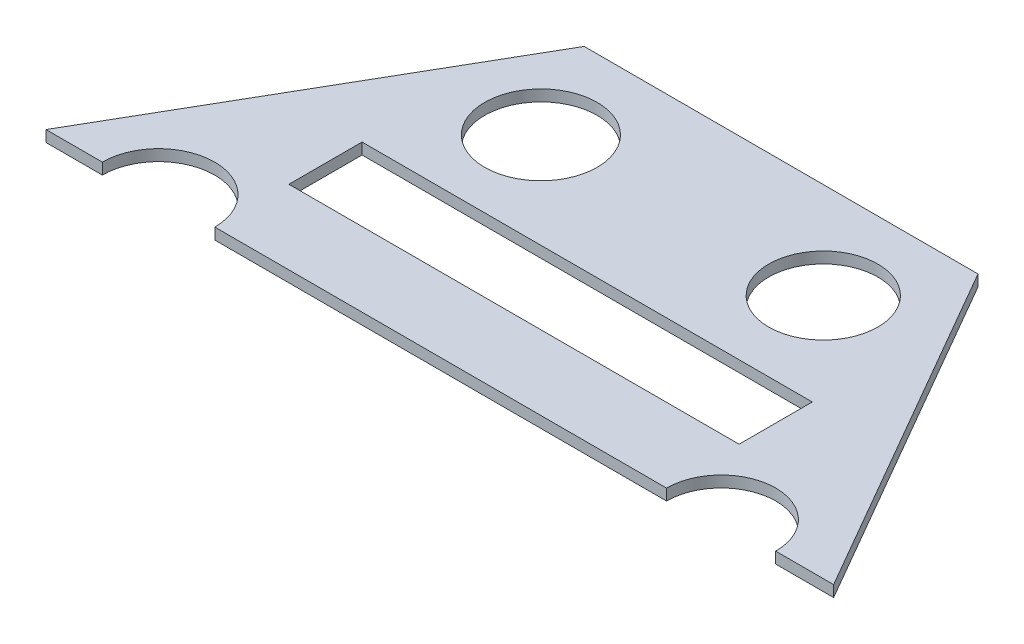
ISO-10303-21;
HEADER;
FILE_DESCRIPTION(('STEP AP214'),'2;1');
FILE_NAME('part.step','',(''),(''),'','','');
FILE_SCHEMA(('AUTOMOTIVE_DESIGN { 1 0 10303 214 1 1 1 1 }'));
ENDSEC;
DATA;
#1=APPLICATION_CONTEXT('core data for automotive mechanical design processes');
#2=APPLICATION_PROTOCOL_DEFINITION('international standard','automotive_design',2000,#1);
#3=PRODUCT_CONTEXT('',#1,'mechanical');
#4=PRODUCT('Part','Part','',(#3));
#5=PRODUCT_RELATED_PRODUCT_CATEGORY('part','',(#4));
#6=PRODUCT_DEFINITION_FORMATION('','',#4);
#7=PRODUCT_DEFINITION_CONTEXT('part definition',#1,'design');
#8=PRODUCT_DEFINITION('design','',#6,#7);
#9=PRODUCT_DEFINITION_SHAPE('','',#8);
#10=(LENGTH_UNIT() NAMED_UNIT(*) SI_UNIT(.MILLI.,.METRE.));
#11=(NAMED_UNIT(*) PLANE_ANGLE_UNIT() SI_UNIT($,.RADIAN.));
#12=(NAMED_UNIT(*) SI_UNIT($,.STERADIAN.) SOLID_ANGLE_UNIT());
#13=UNCERTAINTY_MEASURE_WITH_UNIT(LENGTH_MEASURE(1.E-05),#10,'distance_accuracy_value','');
#14=(GEOMETRIC_REPRESENTATION_CONTEXT(3) GLOBAL_UNCERTAINTY_ASSIGNED_CONTEXT((#13)) GLOBAL_UNIT_ASSIGNED_CONTEXT((#10,
#11,#12)) REPRESENTATION_CONTEXT('',''));
#15=CARTESIAN_POINT('',(0.,0.,0.));
#16=DIRECTION('',(0.,0.,1.));
#17=DIRECTION('',(1.,0.,0.));
#18=AXIS2_PLACEMENT_3D('',#15,#16,#17);
#19=CARTESIAN_POINT('',(0.,10.,0.));
#20=DIRECTION('',(0.,1.,0.));
#21=DIRECTION('',(0.,0.,1.));
#22=AXIS2_PLACEMENT_3D('',#19,#20,#21);
#23=PLANE('',#22);
#24=CARTESIAN_POINT('',(122.996764387359,10.,-217.69749897333));
#25=DIRECTION('',(0.,1.,0.));
#26=DIRECTION('',(0.,0.,1.));
#27=AXIS2_PLACEMENT_3D('',#24,#25,#26);
#28=CIRCLE('',#27,48.5);
#29=CARTESIAN_POINT('',(122.996764387359,10.,-169.19749897333));
#30=VERTEX_POINT('',#29);
#31=EDGE_CURVE('E201',#30,#30,#28,.T.);
#32=ORIENTED_EDGE('',*,*,#31,.F.);
#33=EDGE_LOOP('',(#32));
#34=FACE_BOUND('',#33,.T.);
#35=CARTESIAN_POINT('',(-126.076603065598,10.,-215.895357645728));
#36=DIRECTION('',(0.,1.,0.));
#37=DIRECTION('',(0.,0.,1.));
#38=AXIS2_PLACEMENT_3D('',#35,#36,#37);
#39=CIRCLE('',#38,50.);
#40=CARTESIAN_POINT('',(-126.076603065598,10.,-165.895357645728));
#41=VERTEX_POINT('',#40);
#42=EDGE_CURVE('E192',#41,#41,#39,.T.);
#43=ORIENTED_EDGE('',*,*,#42,.F.);
#44=EDGE_LOOP('',(#43));
#45=FACE_BOUND('',#44,.T.);
#46=DIRECTION('',(0.,0.,-1.));
#47=VECTOR('',#46,1.);
#48=CARTESIAN_POINT('',(200.,10.,-65.913699872319));
#49=LINE('',#48,#47);
#50=CARTESIAN_POINT('',(200.,10.,-65.913699872319));
#51=VERTEX_POINT('',#50);
#52=CARTESIAN_POINT('',(200.,10.,-130.913699872319));
#53=VERTEX_POINT('',#52);
#54=EDGE_CURVE('E221',#51,#53,#49,.T.);
#55=ORIENTED_EDGE('',*,*,#54,.F.);
#56=DIRECTION('',(1.,0.,0.));
#57=VECTOR('',#56,1.);
#58=CARTESIAN_POINT('',(-200.,10.,-65.913699872319));
#59=LINE('',#58,#57);
#60=CARTESIAN_POINT('',(-200.,10.,-65.913699872319));
#61=VERTEX_POINT('',#60);
#62=EDGE_CURVE('E211',#61,#51,#59,.T.);
#63=ORIENTED_EDGE('',*,*,#62,.F.);
#64=DIRECTION('',(0.,0.,1.));
#65=VECTOR('',#64,1.);
#66=CARTESIAN_POINT('',(-200.,10.,-65.913699872319));
#67=LINE('',#66,#65);
#68=CARTESIAN_POINT('',(-200.,10.,-130.913699872319));
#69=VERTEX_POINT('',#68);
#70=EDGE_CURVE('E226',#69,#61,#67,.T.);
#71=ORIENTED_EDGE('',*,*,#70,.F.);
#72=DIRECTION('',(-1.,0.,0.));
#73=VECTOR('',#72,1.);
#74=CARTESIAN_POINT('',(-200.,10.,-130.913699872319));
#75=LINE('',#74,#73);
#76=EDGE_CURVE('E223',#53,#69,#75,.T.);
#77=ORIENTED_EDGE('',*,*,#76,.F.);
#78=EDGE_LOOP('',(#55,#63,#71,#77));
#79=FACE_BOUND('',#78,.T.);
#80=DIRECTION('',(-0.500290723945736,0.,0.865857489159649));
#81=VECTOR('',#80,1.);
#82=CARTESIAN_POINT('',(-174.898226893739,10.,-303.167627278089));
#83=LINE('',#82,#81);
#84=CARTESIAN_POINT('',(-174.898226893739,10.,-303.167627278089));
#85=VERTEX_POINT('',#84);
#86=CARTESIAN_POINT('',(-349.999980274746,10.,-0.117506072211837));
#87=VERTEX_POINT('',#86);
#88=EDGE_CURVE('E148',#85,#87,#83,.T.);
#89=ORIENTED_EDGE('',*,*,#88,.T.);
#90=DIRECTION('',(0.999999943642133,0.,0.000335731634890988));
#91=VECTOR('',#90,1.);
#92=CARTESIAN_POINT('',(0.,10.,0.));
#93=LINE('',#92,#91);
#94=CARTESIAN_POINT('',(-299.999973945815,10.,-0.100719487396418));
#95=VERTEX_POINT('',#94);
#96=EDGE_CURVE('E137',#87,#95,#93,.T.);
#97=ORIENTED_EDGE('',*,*,#96,.T.);
#98=CARTESIAN_POINT('',(-250.000009416956,10.,-0.041161844969737));
#99=DIRECTION('',(0.,1.,0.));
#100=DIRECTION('',(0.,0.,1.));
#101=AXIS2_PLACEMENT_3D('',#98,#99,#100);
#102=CIRCLE('',#101,50.);
#103=CARTESIAN_POINT('',(-200.000016168894,10.,-0.067146336190831));
#104=VERTEX_POINT('',#103);
#105=EDGE_CURVE('E182',#104,#95,#102,.T.);
#106=ORIENTED_EDGE('',*,*,#105,.F.);
#107=CARTESIAN_POINT('',(201.500027455327,10.,0.0676499374607618));
#108=VERTEX_POINT('',#107);
#109=EDGE_CURVE('E63',#104,#108,#93,.T.);
#110=ORIENTED_EDGE('',*,*,#109,.T.);
#111=CARTESIAN_POINT('',(249.999980274746,10.,1.63931368479808E-13));
#112=DIRECTION('',(0.,1.,0.));
#113=DIRECTION('',(0.,0.,1.));
#114=AXIS2_PLACEMENT_3D('',#111,#112,#113);
#115=CIRCLE('',#114,48.5);
#116=CARTESIAN_POINT('',(298.499876736306,10.,0.10021585727939));
#117=VERTEX_POINT('',#116);
#118=EDGE_CURVE('E190',#117,#108,#115,.T.);
#119=ORIENTED_EDGE('',*,*,#118,.F.);
#120=CARTESIAN_POINT('',(349.999980274746,10.,0.117506072211865));
#121=VERTEX_POINT('',#120);
#122=EDGE_CURVE('E56',#117,#121,#93,.T.);
#123=ORIENTED_EDGE('',*,*,#122,.T.);
#124=DIRECTION('',(-0.499709219696397,0.,-0.86619322079454));
#125=VECTOR('',#124,1.);
#126=CARTESIAN_POINT('',(349.999980274746,10.,0.117506072211846));
#127=LINE('',#126,#125);
#128=CARTESIAN_POINT('',(175.101753381008,10.,-303.050121205877));
#129=VERTEX_POINT('',#128);
#130=EDGE_CURVE('E146',#121,#129,#127,.T.);
#131=ORIENTED_EDGE('',*,*,#130,.T.);
#132=DIRECTION('',(-0.999999943642133,0.,-0.00033573163489128));
#133=VECTOR('',#132,1.);
#134=CARTESIAN_POINT('',(175.101753381008,10.,-303.050121205877));
#135=LINE('',#134,#133);
#136=EDGE_CURVE('E236',#129,#85,#135,.T.);
#137=ORIENTED_EDGE('',*,*,#136,.T.);
#138=EDGE_LOOP('',(#89,#97,#106,#110,#119,#123,#131,#137));
#139=FACE_BOUND('',#138,.T.);
#140=ADVANCED_FACE('F41',(#34,#45,#79,#139),#23,.T.);
#141=CARTESIAN_POINT('',(0.,0.,0.));
#142=DIRECTION('',(0.,1.,0.));
#143=DIRECTION('',(0.,0.,1.));
#144=AXIS2_PLACEMENT_3D('',#141,#142,#143);
#145=PLANE('',#144);
#146=DIRECTION('',(1.,0.,0.));
#147=VECTOR('',#146,1.);
#148=CARTESIAN_POINT('',(-200.,0.,-65.913699872319));
#149=LINE('',#148,#147);
#150=CARTESIAN_POINT('',(-200.,0.,-65.913699872319));
#151=VERTEX_POINT('',#150);
#152=CARTESIAN_POINT('',(200.,0.,-65.913699872319));
#153=VERTEX_POINT('',#152);
#154=EDGE_CURVE('E217',#151,#153,#149,.T.);
#155=ORIENTED_EDGE('',*,*,#154,.T.);
#156=DIRECTION('',(0.,0.,-1.));
#157=VECTOR('',#156,1.);
#158=CARTESIAN_POINT('',(200.,0.,-65.913699872319));
#159=LINE('',#158,#157);
#160=CARTESIAN_POINT('',(200.,0.,-130.913699872319));
#161=VERTEX_POINT('',#160);
#162=EDGE_CURVE('E207',#153,#161,#159,.T.);
#163=ORIENTED_EDGE('',*,*,#162,.T.);
#164=DIRECTION('',(-1.,0.,0.));
#165=VECTOR('',#164,1.);
#166=CARTESIAN_POINT('',(-200.,0.,-130.913699872319));
#167=LINE('',#166,#165);
#168=CARTESIAN_POINT('',(-200.,0.,-130.913699872319));
#169=VERTEX_POINT('',#168);
#170=EDGE_CURVE('E210',#161,#169,#167,.T.);
#171=ORIENTED_EDGE('',*,*,#170,.T.);
#172=DIRECTION('',(0.,0.,1.));
#173=VECTOR('',#172,1.);
#174=CARTESIAN_POINT('',(-200.,0.,-65.913699872319));
#175=LINE('',#174,#173);
#176=EDGE_CURVE('E214',#169,#151,#175,.T.);
#177=ORIENTED_EDGE('',*,*,#176,.T.);
#178=EDGE_LOOP('',(#155,#163,#171,#177));
#179=FACE_BOUND('',#178,.T.);
#180=CARTESIAN_POINT('',(-126.076603065598,0.,-215.895357645728));
#181=DIRECTION('',(0.,1.,0.));
#182=DIRECTION('',(0.,0.,1.));
#183=AXIS2_PLACEMENT_3D('',#180,#181,#182);
#184=CIRCLE('',#183,50.);
#185=CARTESIAN_POINT('',(-126.076603065598,0.,-165.895357645728));
#186=VERTEX_POINT('',#185);
#187=EDGE_CURVE('E198',#186,#186,#184,.T.);
#188=ORIENTED_EDGE('',*,*,#187,.T.);
#189=EDGE_LOOP('',(#188));
#190=FACE_BOUND('',#189,.T.);
#191=CARTESIAN_POINT('',(122.996764387359,0.,-217.69749897333));
#192=DIRECTION('',(0.,1.,0.));
#193=DIRECTION('',(0.,0.,1.));
#194=AXIS2_PLACEMENT_3D('',#191,#192,#193);
#195=CIRCLE('',#194,48.5);
#196=CARTESIAN_POINT('',(122.996764387359,0.,-169.19749897333));
#197=VERTEX_POINT('',#196);
#198=EDGE_CURVE('E204',#197,#197,#195,.T.);
#199=ORIENTED_EDGE('',*,*,#198,.T.);
#200=EDGE_LOOP('',(#199));
#201=FACE_BOUND('',#200,.T.);
#202=DIRECTION('',(0.999999943642133,0.,0.000335731634890988));
#203=VECTOR('',#202,1.);
#204=CARTESIAN_POINT('',(0.,0.,0.));
#205=LINE('',#204,#203);
#206=CARTESIAN_POINT('',(-349.999980274746,0.,-0.117506072211837));
#207=VERTEX_POINT('',#206);
#208=CARTESIAN_POINT('',(-299.999973945815,0.,-0.100719487396418));
#209=VERTEX_POINT('',#208);
#210=EDGE_CURVE('E139',#207,#209,#205,.T.);
#211=ORIENTED_EDGE('',*,*,#210,.F.);
#212=DIRECTION('',(-0.500290723945736,0.,0.865857489159649));
#213=VECTOR('',#212,1.);
#214=CARTESIAN_POINT('',(-174.898226893739,0.,-303.167627278089));
#215=LINE('',#214,#213);
#216=CARTESIAN_POINT('',(-174.898226893739,0.,-303.167627278089));
#217=VERTEX_POINT('',#216);
#218=EDGE_CURVE('E157',#217,#207,#215,.T.);
#219=ORIENTED_EDGE('',*,*,#218,.F.);
#220=DIRECTION('',(-0.999999943642133,0.,-0.00033573163489128));
#221=VECTOR('',#220,1.);
#222=CARTESIAN_POINT('',(175.101753381008,0.,-303.050121205877));
#223=LINE('',#222,#221);
#224=CARTESIAN_POINT('',(175.101753381008,0.,-303.050121205877));
#225=VERTEX_POINT('',#224);
#226=EDGE_CURVE('E153',#225,#217,#223,.T.);
#227=ORIENTED_EDGE('',*,*,#226,.F.);
#228=DIRECTION('',(-0.499709219696397,0.,-0.86619322079454));
#229=VECTOR('',#228,1.);
#230=CARTESIAN_POINT('',(349.999980274746,0.,0.117506072211846));
#231=LINE('',#230,#229);
#232=CARTESIAN_POINT('',(349.999980274746,0.,0.117506072211865));
#233=VERTEX_POINT('',#232);
#234=EDGE_CURVE('E144',#233,#225,#231,.T.);
#235=ORIENTED_EDGE('',*,*,#234,.F.);
#236=CARTESIAN_POINT('',(298.499876736306,0.,0.10021585727939));
#237=VERTEX_POINT('',#236);
#238=EDGE_CURVE('E127',#237,#233,#205,.T.);
#239=ORIENTED_EDGE('',*,*,#238,.F.);
#240=CARTESIAN_POINT('',(249.999980274746,0.,1.63931368479808E-13));
#241=DIRECTION('',(0.,1.,0.));
#242=DIRECTION('',(0.,0.,1.));
#243=AXIS2_PLACEMENT_3D('',#240,#241,#242);
#244=CIRCLE('',#243,48.5);
#245=CARTESIAN_POINT('',(201.500027455327,0.,0.0676499374607618));
#246=VERTEX_POINT('',#245);
#247=EDGE_CURVE('E187',#237,#246,#244,.T.);
#248=ORIENTED_EDGE('',*,*,#247,.T.);
#249=CARTESIAN_POINT('',(-200.000016168894,0.,-0.067146336190831));
#250=VERTEX_POINT('',#249);
#251=EDGE_CURVE('E136',#250,#246,#205,.T.);
#252=ORIENTED_EDGE('',*,*,#251,.F.);
#253=CARTESIAN_POINT('',(-250.000009416956,0.,-0.041161844969737));
#254=DIRECTION('',(0.,1.,0.));
#255=DIRECTION('',(0.,0.,1.));
#256=AXIS2_PLACEMENT_3D('',#253,#254,#255);
#257=CIRCLE('',#256,50.);
#258=EDGE_CURVE('E188',#250,#209,#257,.T.);
#259=ORIENTED_EDGE('',*,*,#258,.T.);
#260=EDGE_LOOP('',(#211,#219,#227,#235,#239,#248,#252,#259));
#261=FACE_BOUND('',#260,.T.);
#262=ADVANCED_FACE('F151',(#179,#190,#201,#261),#145,.F.);
#263=CARTESIAN_POINT('',(249.999980274746,0.,1.63931368479808E-13));
#264=DIRECTION('',(0.,1.,0.));
#265=DIRECTION('',(0.,0.,1.));
#266=AXIS2_PLACEMENT_3D('',#263,#264,#265);
#267=CYLINDRICAL_SURFACE('',#266,48.5);
#268=DIRECTION('',(0.,1.,0.));
#269=VECTOR('',#268,1.);
#270=CARTESIAN_POINT('',(298.499876736306,0.,0.10021585727939));
#271=LINE('',#270,#269);
#272=EDGE_CURVE('E131',#117,#237,#271,.F.);
#273=ORIENTED_EDGE('',*,*,#272,.F.);
#274=ORIENTED_EDGE('',*,*,#118,.T.);
#275=DIRECTION('',(0.,1.,0.));
#276=VECTOR('',#275,1.);
#277=CARTESIAN_POINT('',(201.500027455327,0.,0.0676499374607618));
#278=LINE('',#277,#276);
#279=EDGE_CURVE('E243',#246,#108,#278,.T.);
#280=ORIENTED_EDGE('',*,*,#279,.F.);
#281=ORIENTED_EDGE('',*,*,#247,.F.);
#282=EDGE_LOOP('',(#273,#274,#280,#281));
#283=FACE_BOUND('',#282,.T.);
#284=ADVANCED_FACE('F250',(#283),#267,.F.);
#285=CARTESIAN_POINT('',(-250.000009416956,0.,-0.041161844969737));
#286=DIRECTION('',(0.,1.,0.));
#287=DIRECTION('',(0.,0.,1.));
#288=AXIS2_PLACEMENT_3D('',#285,#286,#287);
#289=CYLINDRICAL_SURFACE('',#288,50.);
#290=DIRECTION('',(0.,1.,0.));
#291=VECTOR('',#290,1.);
#292=CARTESIAN_POINT('',(-200.000016168894,0.,-0.067146336190831));
#293=LINE('',#292,#291);
#294=EDGE_CURVE('E11',#104,#250,#293,.F.);
#295=ORIENTED_EDGE('',*,*,#294,.F.);
#296=ORIENTED_EDGE('',*,*,#105,.T.);
#297=DIRECTION('',(0.,1.,0.));
#298=VECTOR('',#297,1.);
#299=CARTESIAN_POINT('',(-299.999973945815,0.,-0.100719487396418));
#300=LINE('',#299,#298);
#301=EDGE_CURVE('E49',#209,#95,#300,.T.);
#302=ORIENTED_EDGE('',*,*,#301,.F.);
#303=ORIENTED_EDGE('',*,*,#258,.F.);
#304=EDGE_LOOP('',(#295,#296,#302,#303));
#305=FACE_BOUND('',#304,.T.);
#306=ADVANCED_FACE('F186',(#305),#289,.F.);
#307=CARTESIAN_POINT('',(349.999980274746,10.,0.117506072211846));
#308=DIRECTION('',(-0.86619322079454,0.,0.499709219696397));
#309=DIRECTION('',(0.499709219696397,0.,0.86619322079454));
#310=AXIS2_PLACEMENT_3D('',#307,#308,#309);
#311=PLANE('',#310);
#312=ORIENTED_EDGE('',*,*,#234,.T.);
#313=DIRECTION('',(0.,-1.,0.));
#314=VECTOR('',#313,1.);
#315=CARTESIAN_POINT('',(175.101753381008,10.,-303.050121205877));
#316=LINE('',#315,#314);
#317=EDGE_CURVE('E170',#129,#225,#316,.T.);
#318=ORIENTED_EDGE('',*,*,#317,.F.);
#319=ORIENTED_EDGE('',*,*,#130,.F.);
#320=DIRECTION('',(0.,-1.,0.));
#321=VECTOR('',#320,1.);
#322=CARTESIAN_POINT('',(349.999980274746,10.,0.117506072211846));
#323=LINE('',#322,#321);
#324=EDGE_CURVE('E130',#121,#233,#323,.T.);
#325=ORIENTED_EDGE('',*,*,#324,.T.);
#326=EDGE_LOOP('',(#312,#318,#319,#325));
#327=FACE_BOUND('',#326,.T.);
#328=ADVANCED_FACE('F43',(#327),#311,.F.);
#329=CARTESIAN_POINT('',(175.101753381008,10.,-303.050121205877));
#330=DIRECTION('',(-0.00033573163489128,0.,0.999999943642133));
#331=DIRECTION('',(0.999999943642133,0.,0.00033573163489128));
#332=AXIS2_PLACEMENT_3D('',#329,#330,#331);
#333=PLANE('',#332);
#334=ORIENTED_EDGE('',*,*,#226,.T.);
#335=DIRECTION('',(0.,-1.,0.));
#336=VECTOR('',#335,1.);
#337=CARTESIAN_POINT('',(-174.898226893739,10.,-303.167627278089));
#338=LINE('',#337,#336);
#339=EDGE_CURVE('E167',#85,#217,#338,.T.);
#340=ORIENTED_EDGE('',*,*,#339,.F.);
#341=ORIENTED_EDGE('',*,*,#136,.F.);
#342=ORIENTED_EDGE('',*,*,#317,.T.);
#343=EDGE_LOOP('',(#334,#340,#341,#342));
#344=FACE_BOUND('',#343,.T.);
#345=ADVANCED_FACE('F239',(#344),#333,.F.);
#346=CARTESIAN_POINT('',(-174.898226893739,10.,-303.167627278089));
#347=DIRECTION('',(0.865857489159649,0.,0.500290723945736));
#348=DIRECTION('',(0.500290723945736,0.,-0.865857489159649));
#349=AXIS2_PLACEMENT_3D('',#346,#347,#348);
#350=PLANE('',#349);
#351=ORIENTED_EDGE('',*,*,#218,.T.);
#352=DIRECTION('',(0.,-1.,0.));
#353=VECTOR('',#352,1.);
#354=CARTESIAN_POINT('',(-349.999980274746,10.,-0.117506072211846));
#355=LINE('',#354,#353);
#356=EDGE_CURVE('E147',#87,#207,#355,.T.);
#357=ORIENTED_EDGE('',*,*,#356,.F.);
#358=ORIENTED_EDGE('',*,*,#88,.F.);
#359=ORIENTED_EDGE('',*,*,#339,.T.);
#360=EDGE_LOOP('',(#351,#357,#358,#359));
#361=FACE_BOUND('',#360,.T.);
#362=ADVANCED_FACE('F241',(#361),#350,.F.);
#363=CARTESIAN_POINT('',(200.,0.,-65.913699872319));
#364=DIRECTION('',(1.,0.,0.));
#365=DIRECTION('',(0.,0.,-1.));
#366=AXIS2_PLACEMENT_3D('',#363,#364,#365);
#367=PLANE('',#366);
#368=ORIENTED_EDGE('',*,*,#54,.T.);
#369=DIRECTION('',(0.,1.,0.));
#370=VECTOR('',#369,1.);
#371=CARTESIAN_POINT('',(200.,0.,-130.913699872319));
#372=LINE('',#371,#370);
#373=EDGE_CURVE('E220',#161,#53,#372,.T.);
#374=ORIENTED_EDGE('',*,*,#373,.F.);
#375=ORIENTED_EDGE('',*,*,#162,.F.);
#376=DIRECTION('',(0.,1.,0.));
#377=VECTOR('',#376,1.);
#378=CARTESIAN_POINT('',(200.,0.,-65.913699872319));
#379=LINE('',#378,#377);
#380=EDGE_CURVE('E155',#153,#51,#379,.T.);
#381=ORIENTED_EDGE('',*,*,#380,.T.);
#382=EDGE_LOOP('',(#368,#374,#375,#381));
#383=FACE_BOUND('',#382,.T.);
#384=ADVANCED_FACE('F271',(#383),#367,.F.);
#385=CARTESIAN_POINT('',(-200.,0.,-65.913699872319));
#386=DIRECTION('',(0.,0.,1.));
#387=DIRECTION('',(1.,0.,0.));
#388=AXIS2_PLACEMENT_3D('',#385,#386,#387);
#389=PLANE('',#388);
#390=ORIENTED_EDGE('',*,*,#62,.T.);
#391=ORIENTED_EDGE('',*,*,#380,.F.);
#392=ORIENTED_EDGE('',*,*,#154,.F.);
#393=DIRECTION('',(0.,1.,0.));
#394=VECTOR('',#393,1.);
#395=CARTESIAN_POINT('',(-200.,0.,-65.913699872319));
#396=LINE('',#395,#394);
#397=EDGE_CURVE('E159',#151,#61,#396,.T.);
#398=ORIENTED_EDGE('',*,*,#397,.T.);
#399=EDGE_LOOP('',(#390,#391,#392,#398));
#400=FACE_BOUND('',#399,.T.);
#401=ADVANCED_FACE('F295',(#400),#389,.F.);
#402=CARTESIAN_POINT('',(-200.,0.,-65.913699872319));
#403=DIRECTION('',(-1.,0.,0.));
#404=DIRECTION('',(0.,0.,1.));
#405=AXIS2_PLACEMENT_3D('',#402,#403,#404);
#406=PLANE('',#405);
#407=ORIENTED_EDGE('',*,*,#70,.T.);
#408=ORIENTED_EDGE('',*,*,#397,.F.);
#409=ORIENTED_EDGE('',*,*,#176,.F.);
#410=DIRECTION('',(0.,1.,0.));
#411=VECTOR('',#410,1.);
#412=CARTESIAN_POINT('',(-200.,0.,-130.913699872319));
#413=LINE('',#412,#411);
#414=EDGE_CURVE('E232',#169,#69,#413,.T.);
#415=ORIENTED_EDGE('',*,*,#414,.T.);
#416=EDGE_LOOP('',(#407,#408,#409,#415));
#417=FACE_BOUND('',#416,.T.);
#418=ADVANCED_FACE('F298',(#417),#406,.F.);
#419=CARTESIAN_POINT('',(-200.,0.,-130.913699872319));
#420=DIRECTION('',(0.,0.,-1.));
#421=DIRECTION('',(-1.,0.,0.));
#422=AXIS2_PLACEMENT_3D('',#419,#420,#421);
#423=PLANE('',#422);
#424=ORIENTED_EDGE('',*,*,#76,.T.);
#425=ORIENTED_EDGE('',*,*,#414,.F.);
#426=ORIENTED_EDGE('',*,*,#170,.F.);
#427=ORIENTED_EDGE('',*,*,#373,.T.);
#428=EDGE_LOOP('',(#424,#425,#426,#427));
#429=FACE_BOUND('',#428,.T.);
#430=ADVANCED_FACE('F290',(#429),#423,.F.);
#431=CARTESIAN_POINT('',(-126.076603065598,0.,-215.895357645728));
#432=DIRECTION('',(0.,1.,0.));
#433=DIRECTION('',(0.,0.,1.));
#434=AXIS2_PLACEMENT_3D('',#431,#432,#433);
#435=CYLINDRICAL_SURFACE('',#434,50.);
#436=ORIENTED_EDGE('',*,*,#187,.F.);
#437=EDGE_LOOP('',(#436));
#438=FACE_BOUND('',#437,.T.);
#439=ORIENTED_EDGE('',*,*,#42,.T.);
#440=EDGE_LOOP('',(#439));
#441=FACE_BOUND('',#440,.T.);
#442=ADVANCED_FACE('F287',(#438,#441),#435,.F.);
#443=CARTESIAN_POINT('',(122.996764387359,0.,-217.69749897333));
#444=DIRECTION('',(0.,1.,0.));
#445=DIRECTION('',(0.,0.,1.));
#446=AXIS2_PLACEMENT_3D('',#443,#444,#445);
#447=CYLINDRICAL_SURFACE('',#446,48.5);
#448=ORIENTED_EDGE('',*,*,#198,.F.);
#449=EDGE_LOOP('',(#448));
#450=FACE_BOUND('',#449,.T.);
#451=ORIENTED_EDGE('',*,*,#31,.T.);
#452=EDGE_LOOP('',(#451));
#453=FACE_BOUND('',#452,.T.);
#454=ADVANCED_FACE('F258',(#450,#453),#447,.F.);
#455=CARTESIAN_POINT('',(0.,0.,0.));
#456=DIRECTION('',(-0.000335731634890988,0.,0.999999943642133));
#457=DIRECTION('',(0.999999943642133,0.,0.000335731634890988));
#458=AXIS2_PLACEMENT_3D('',#455,#456,#457);
#459=PLANE('',#458);
#460=ORIENTED_EDGE('',*,*,#301,.T.);
#461=ORIENTED_EDGE('',*,*,#96,.F.);
#462=ORIENTED_EDGE('',*,*,#356,.T.);
#463=ORIENTED_EDGE('',*,*,#210,.T.);
#464=EDGE_LOOP('',(#460,#461,#462,#463));
#465=FACE_BOUND('',#464,.T.);
#466=ADVANCED_FACE('F174',(#465),#459,.T.);
#467=ORIENTED_EDGE('',*,*,#279,.T.);
#468=ORIENTED_EDGE('',*,*,#109,.F.);
#469=ORIENTED_EDGE('',*,*,#294,.T.);
#470=ORIENTED_EDGE('',*,*,#251,.T.);
#471=EDGE_LOOP('',(#467,#468,#469,#470));
#472=FACE_BOUND('',#471,.T.);
#473=ADVANCED_FACE('F251',(#472),#459,.T.);
#474=ORIENTED_EDGE('',*,*,#272,.T.);
#475=ORIENTED_EDGE('',*,*,#238,.T.);
#476=ORIENTED_EDGE('',*,*,#324,.F.);
#477=ORIENTED_EDGE('',*,*,#122,.F.);
#478=EDGE_LOOP('',(#474,#475,#476,#477));
#479=FACE_BOUND('',#478,.T.);
#480=ADVANCED_FACE('F129',(#479),#459,.T.);
#481=CLOSED_SHELL('',(#140,#262,#284,#306,#328,#345,#362,#384,#401,#418,#430,#442,#454,#466,
#473,#480));
#482=MANIFOLD_SOLID_BREP('B2',#481);
#483=ADVANCED_BREP_SHAPE_REPRESENTATION('',(#18,#482),#14);
#484=SHAPE_DEFINITION_REPRESENTATION(#9,#483);
ENDSEC;
END-ISO-10303-21;
